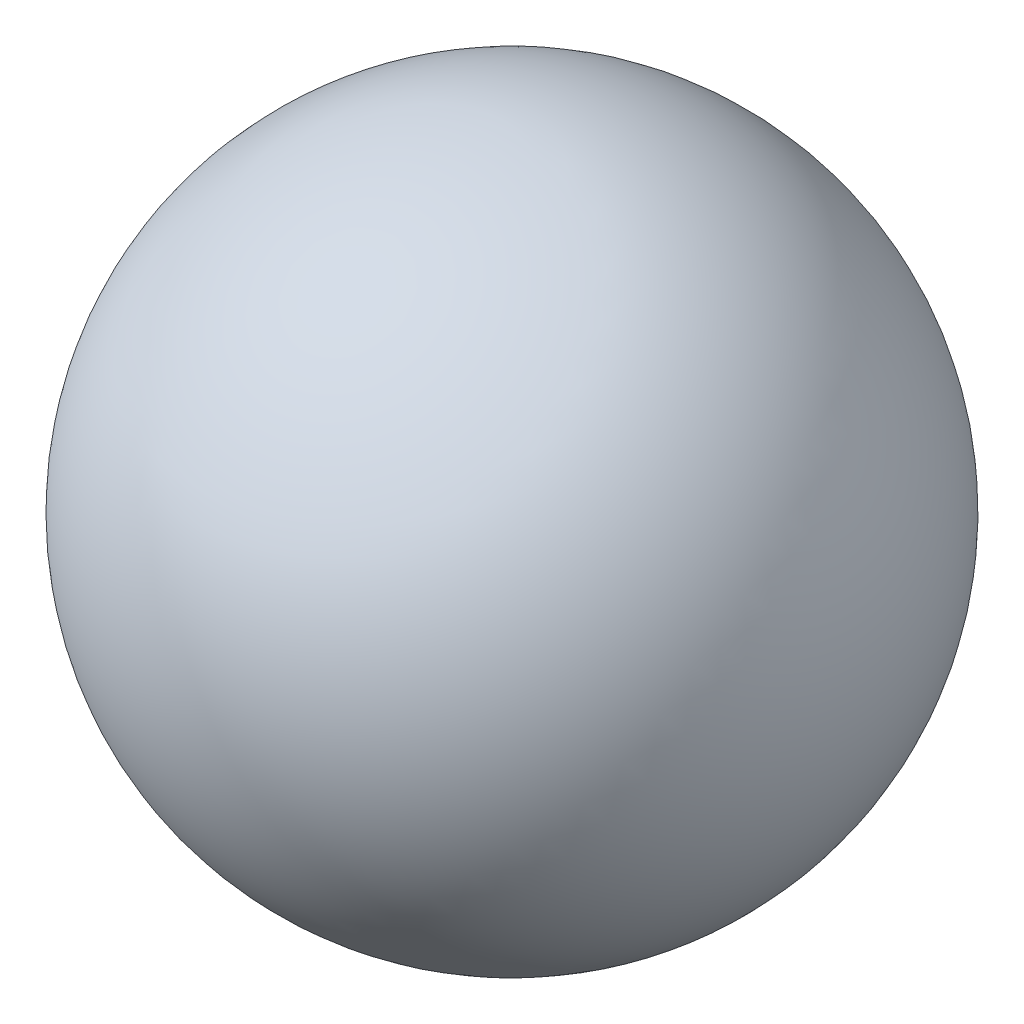
ISO-10303-21;
HEADER;
FILE_DESCRIPTION(('STEP AP214'),'2;1');
FILE_NAME('part.step','',(''),(''),'','','');
FILE_SCHEMA(('AUTOMOTIVE_DESIGN { 1 0 10303 214 1 1 1 1 }'));
ENDSEC;
DATA;
#1=APPLICATION_CONTEXT('core data for automotive mechanical design processes');
#2=APPLICATION_PROTOCOL_DEFINITION('international standard','automotive_design',2000,#1);
#3=PRODUCT_CONTEXT('',#1,'mechanical');
#4=PRODUCT('Part','Part','',(#3));
#5=PRODUCT_RELATED_PRODUCT_CATEGORY('part','',(#4));
#6=PRODUCT_DEFINITION_FORMATION('','',#4);
#7=PRODUCT_DEFINITION_CONTEXT('part definition',#1,'design');
#8=PRODUCT_DEFINITION('design','',#6,#7);
#9=PRODUCT_DEFINITION_SHAPE('','',#8);
#10=(LENGTH_UNIT() NAMED_UNIT(*) SI_UNIT(.MILLI.,.METRE.));
#11=(NAMED_UNIT(*) PLANE_ANGLE_UNIT() SI_UNIT($,.RADIAN.));
#12=(NAMED_UNIT(*) SI_UNIT($,.STERADIAN.) SOLID_ANGLE_UNIT());
#13=UNCERTAINTY_MEASURE_WITH_UNIT(LENGTH_MEASURE(1.E-05),#10,'distance_accuracy_value','');
#14=(GEOMETRIC_REPRESENTATION_CONTEXT(3) GLOBAL_UNCERTAINTY_ASSIGNED_CONTEXT((#13)) GLOBAL_UNIT_ASSIGNED_CONTEXT((#10,
#11,#12)) REPRESENTATION_CONTEXT('',''));
#15=CARTESIAN_POINT('',(0.,0.,0.));
#16=DIRECTION('',(0.,0.,1.));
#17=DIRECTION('',(1.,0.,0.));
#18=AXIS2_PLACEMENT_3D('',#15,#16,#17);
#19=CARTESIAN_POINT('',(-0.886941120529906,-3.20341423873236,11.0450567473118));
#20=DIRECTION('',(0.071985809757809,-0.959461018988077,-0.272493295763168));
#21=DIRECTION('',(-0.99443709239794,-0.0479784857230145,-0.0937706466377299));
#22=AXIS2_PLACEMENT_3D('',#19,#20,#21);
#23=SPHERICAL_SURFACE('',#22,4.8749371855331);
#24=CARTESIAN_POINT('',(-0.536014819710852,-7.88072643826682,9.7166690469875));
#25=VERTEX_POINT('',#24);
#26=VERTEX_LOOP('',#25);
#27=FACE_BOUND('',#26,.T.);
#28=ADVANCED_FACE('F29',(#27),#23,.T.);
#29=CLOSED_SHELL('',(#28));
#30=MANIFOLD_SOLID_BREP('B2',#29);
#31=ADVANCED_BREP_SHAPE_REPRESENTATION('',(#18,#30),#14);
#32=SHAPE_DEFINITION_REPRESENTATION(#9,#31);
ENDSEC;
END-ISO-10303-21;
